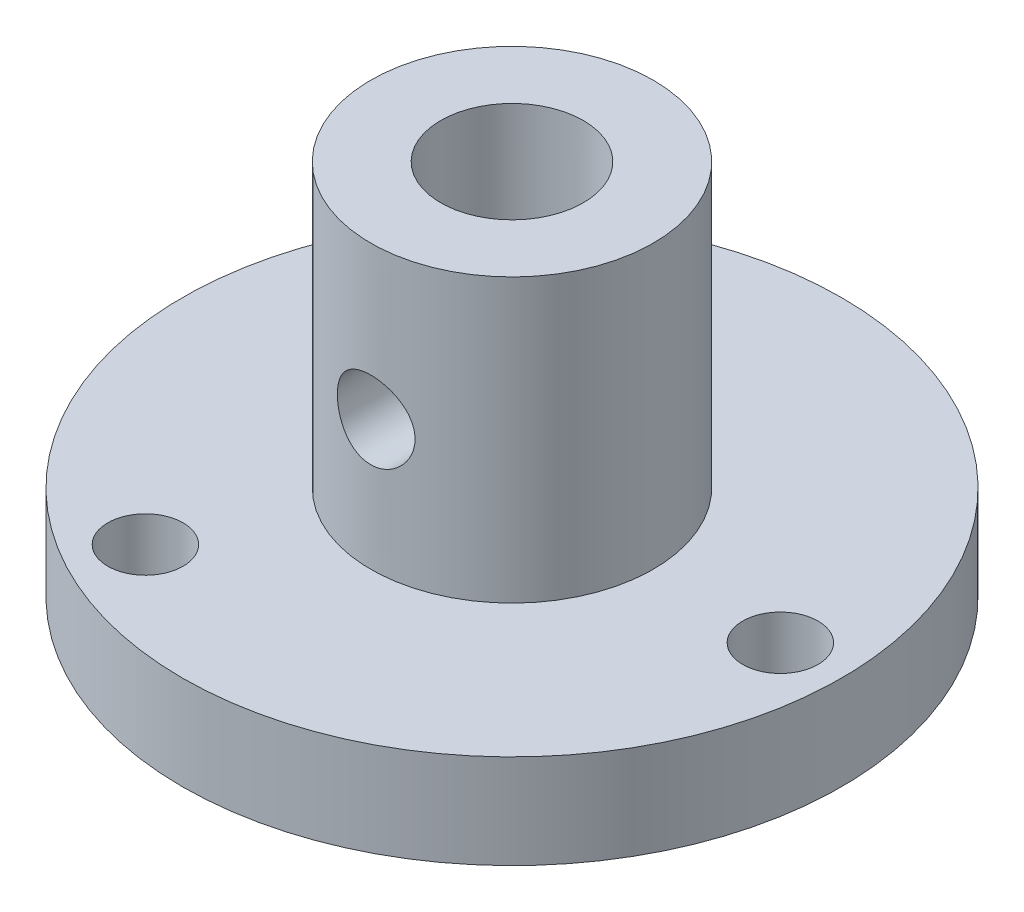
ISO-10303-21;
HEADER;
FILE_DESCRIPTION(('STEP AP214'),'2;1');
FILE_NAME('part.step','',(''),(''),'','','');
FILE_SCHEMA(('AUTOMOTIVE_DESIGN { 1 0 10303 214 1 1 1 1 }'));
ENDSEC;
DATA;
#1=APPLICATION_CONTEXT('core data for automotive mechanical design processes');
#2=APPLICATION_PROTOCOL_DEFINITION('international standard','automotive_design',2000,#1);
#3=PRODUCT_CONTEXT('',#1,'mechanical');
#4=PRODUCT('Part','Part','',(#3));
#5=PRODUCT_RELATED_PRODUCT_CATEGORY('part','',(#4));
#6=PRODUCT_DEFINITION_FORMATION('','',#4);
#7=PRODUCT_DEFINITION_CONTEXT('part definition',#1,'design');
#8=PRODUCT_DEFINITION('design','',#6,#7);
#9=PRODUCT_DEFINITION_SHAPE('','',#8);
#10=(LENGTH_UNIT() NAMED_UNIT(*) SI_UNIT(.MILLI.,.METRE.));
#11=(NAMED_UNIT(*) PLANE_ANGLE_UNIT() SI_UNIT($,.RADIAN.));
#12=(NAMED_UNIT(*) SI_UNIT($,.STERADIAN.) SOLID_ANGLE_UNIT());
#13=UNCERTAINTY_MEASURE_WITH_UNIT(LENGTH_MEASURE(1.E-05),#10,'distance_accuracy_value','');
#14=(GEOMETRIC_REPRESENTATION_CONTEXT(3) GLOBAL_UNCERTAINTY_ASSIGNED_CONTEXT((#13)) GLOBAL_UNIT_ASSIGNED_CONTEXT((#10,
#11,#12)) REPRESENTATION_CONTEXT('',''));
#15=CARTESIAN_POINT('',(0.,0.,0.));
#16=DIRECTION('',(0.,0.,1.));
#17=DIRECTION('',(1.,0.,0.));
#18=AXIS2_PLACEMENT_3D('',#15,#16,#17);
#19=CARTESIAN_POINT('',(-14.,0.,0.));
#20=DIRECTION('',(0.,1.,0.));
#21=DIRECTION('',(0.,0.,1.));
#22=AXIS2_PLACEMENT_3D('',#19,#20,#21);
#23=PLANE('',#22);
#24=CARTESIAN_POINT('',(11.4,0.,0.));
#25=DIRECTION('',(0.,-1.,0.));
#26=DIRECTION('',(0.,0.,-1.));
#27=AXIS2_PLACEMENT_3D('',#24,#25,#26);
#28=CIRCLE('',#27,1.6);
#29=CARTESIAN_POINT('',(11.4,0.,-1.6));
#30=VERTEX_POINT('',#29);
#31=EDGE_CURVE('E104',#30,#30,#28,.T.);
#32=ORIENTED_EDGE('',*,*,#31,.F.);
#33=EDGE_LOOP('',(#32));
#34=FACE_BOUND('',#33,.T.);
#35=CARTESIAN_POINT('',(-5.7,0.,-9.8726896031426));
#36=DIRECTION('',(0.,-1.,0.));
#37=DIRECTION('',(0.,0.,-1.));
#38=AXIS2_PLACEMENT_3D('',#35,#36,#37);
#39=CIRCLE('',#38,1.6);
#40=CARTESIAN_POINT('',(-5.7,0.,-11.4726896031426));
#41=VERTEX_POINT('',#40);
#42=EDGE_CURVE('E108',#41,#41,#39,.T.);
#43=ORIENTED_EDGE('',*,*,#42,.F.);
#44=EDGE_LOOP('',(#43));
#45=FACE_BOUND('',#44,.T.);
#46=CARTESIAN_POINT('',(-5.70000000000001,0.,9.8726896031426));
#47=DIRECTION('',(0.,-1.,0.));
#48=DIRECTION('',(0.,0.,-1.));
#49=AXIS2_PLACEMENT_3D('',#46,#47,#48);
#50=CIRCLE('',#49,1.6);
#51=CARTESIAN_POINT('',(-5.70000000000001,0.,8.2726896031426));
#52=VERTEX_POINT('',#51);
#53=EDGE_CURVE('E112',#52,#52,#50,.T.);
#54=ORIENTED_EDGE('',*,*,#53,.F.);
#55=EDGE_LOOP('',(#54));
#56=FACE_BOUND('',#55,.T.);
#57=CARTESIAN_POINT('',(0.,0.,0.));
#58=DIRECTION('',(0.,-1.,0.));
#59=DIRECTION('',(0.,0.,-1.));
#60=AXIS2_PLACEMENT_3D('',#57,#58,#59);
#61=CIRCLE('',#60,3.03);
#62=CARTESIAN_POINT('',(0.,0.,-3.03));
#63=VERTEX_POINT('',#62);
#64=EDGE_CURVE('E43',#63,#63,#61,.T.);
#65=ORIENTED_EDGE('',*,*,#64,.F.);
#66=EDGE_LOOP('',(#65));
#67=FACE_BOUND('',#66,.T.);
#68=CARTESIAN_POINT('',(0.,0.,0.));
#69=DIRECTION('',(0.,-1.,0.));
#70=DIRECTION('',(0.,0.,-1.));
#71=AXIS2_PLACEMENT_3D('',#68,#69,#70);
#72=CIRCLE('',#71,14.);
#73=CARTESIAN_POINT('',(0.,0.,-14.));
#74=VERTEX_POINT('',#73);
#75=EDGE_CURVE('E117',#74,#74,#72,.T.);
#76=ORIENTED_EDGE('',*,*,#75,.T.);
#77=EDGE_LOOP('',(#76));
#78=FACE_BOUND('',#77,.T.);
#79=ADVANCED_FACE('F31',(#34,#45,#56,#67,#78),#23,.F.);
#80=CARTESIAN_POINT('',(0.,0.,0.));
#81=DIRECTION('',(0.,-1.,0.));
#82=DIRECTION('',(0.,0.,-1.));
#83=AXIS2_PLACEMENT_3D('',#80,#81,#82);
#84=CYLINDRICAL_SURFACE('',#83,3.03);
#85=CARTESIAN_POINT('',(0.,11.15,-3.03));
#86=CARTESIAN_POINT('',(0.0857900428712125,11.1499945273613,-3.02999507756451));
#87=CARTESIAN_POINT('',(0.171653181634683,11.1432704140494,-3.02631917424866));
#88=CARTESIAN_POINT('',(0.340781906956645,11.1167004965323,-3.01197614440897));
#89=CARTESIAN_POINT('',(0.424043613362761,11.0968359878209,-3.00129905233361));
#90=CARTESIAN_POINT('',(0.585278058846019,11.0450217221375,-2.97405615459032));
#91=CARTESIAN_POINT('',(0.663270944531754,11.0131214804714,-2.9575144925062));
#92=CARTESIAN_POINT('',(0.812646234867152,10.9384320901137,-2.9200078154471));
#93=CARTESIAN_POINT('',(0.884028437355437,10.8956426085682,-2.89904266526161));
#94=CARTESIAN_POINT('',(1.02360718669968,10.7971176834172,-2.85287437137156));
#95=CARTESIAN_POINT('',(1.09125810199276,10.7407003617907,-2.82748010162747));
#96=CARTESIAN_POINT('',(1.21665314613362,10.6180165959611,-2.77583549606193));
#97=CARTESIAN_POINT('',(1.27438820626557,10.5517412381873,-2.74958440244971));
#98=CARTESIAN_POINT('',(1.38391353230633,10.4036366690131,-2.6962454424667));
#99=CARTESIAN_POINT('',(1.43459937338473,10.3209248099166,-2.66931958046948));
#100=CARTESIAN_POINT('',(1.52114231588487,10.1465870623383,-2.62097257045302));
#101=CARTESIAN_POINT('',(1.55701106668759,10.0549682469,-2.59954710299144));
#102=CARTESIAN_POINT('',(1.61037044280218,9.87117130692412,-2.56681491739963));
#103=CARTESIAN_POINT('',(1.62887665894372,9.77939216922618,-2.5549556850791));
#104=CARTESIAN_POINT('',(1.65000650284633,9.59333465582496,-2.54136898627085));
#105=CARTESIAN_POINT('',(1.65265197279999,9.49905989680712,-2.53962758638929));
#106=CARTESIAN_POINT('',(1.64272566474407,9.32580491202942,-2.54604787087849));
#107=CARTESIAN_POINT('',(1.63235357390399,9.24663089207596,-2.55277847780364));
#108=CARTESIAN_POINT('',(1.60056914879971,9.09139428157913,-2.57282496763416));
#109=CARTESIAN_POINT('',(1.57915198852743,9.01533306683123,-2.58614372904916));
#110=CARTESIAN_POINT('',(1.52558763297467,8.86636682623806,-2.6181037629647));
#111=CARTESIAN_POINT('',(1.49321577290092,8.79356736680224,-2.63685518592046));
#112=CARTESIAN_POINT('',(1.41885196086493,8.65405976576548,-2.6776025958069));
#113=CARTESIAN_POINT('',(1.37685581372334,8.58735429829242,-2.69959999614973));
#114=CARTESIAN_POINT('',(1.27691470037281,8.4511034635962,-2.74844219543159));
#115=CARTESIAN_POINT('',(1.21750905154334,8.38270595115796,-2.77551145314171));
#116=CARTESIAN_POINT('',(1.08808811563565,8.25631507641247,-2.82875671637267));
#117=CARTESIAN_POINT('',(1.01806588806105,8.19832857477771,-2.85493212372988));
#118=CARTESIAN_POINT('',(0.863760401968638,8.09081117325527,-2.90548056114207));
#119=CARTESIAN_POINT('',(0.778848407415769,8.04206753706778,-2.92962823392749));
#120=CARTESIAN_POINT('',(0.600395571549132,7.95998548407507,-2.97132813758002));
#121=CARTESIAN_POINT('',(0.506862806536939,7.92663282086067,-2.98888646494642));
#122=CARTESIAN_POINT('',(0.323034681068676,7.8794113640325,-3.01402528451312));
#123=CARTESIAN_POINT('',(0.233234505590317,7.86403104876656,-3.02237578233863));
#124=CARTESIAN_POINT('',(0.0519612365216904,7.84831577524807,-3.03090955802723));
#125=CARTESIAN_POINT('',(-0.0395107873152874,7.8479715114209,-3.03109788732686));
#126=CARTESIAN_POINT('',(-0.212201302224604,7.86163128214628,-3.02367808060858));
#127=CARTESIAN_POINT('',(-0.293565428252568,7.87426952196596,-3.01681206784779));
#128=CARTESIAN_POINT('',(-0.452811941335436,7.91124438807081,-2.99704865741896));
#129=CARTESIAN_POINT('',(-0.530693972082229,7.93558220854385,-2.98415064406224));
#130=CARTESIAN_POINT('',(-0.682933484711772,7.99568642887272,-2.95308035081049));
#131=CARTESIAN_POINT('',(-0.757166417229481,8.03170611190813,-2.93479208735981));
#132=CARTESIAN_POINT('',(-0.898735278200689,8.11382553469683,-2.89458091336468));
#133=CARTESIAN_POINT('',(-0.96606861349367,8.15992904412122,-2.8726566443029));
#134=CARTESIAN_POINT('',(-1.09985687563983,8.2667399524287,-2.82432562173432));
#135=CARTESIAN_POINT('',(-1.16539117367597,8.32849853961545,-2.79769128707377));
#136=CARTESIAN_POINT('',(-1.28565851355061,8.46189619053283,-2.7445064236284));
#137=CARTESIAN_POINT('',(-1.34038069850613,8.53354506413898,-2.71795600515957));
#138=CARTESIAN_POINT('',(-1.44144296354111,8.69120807301673,-2.66582275395467));
#139=CARTESIAN_POINT('',(-1.48685909053113,8.77789380054494,-2.64045810733742));
#140=CARTESIAN_POINT('',(-1.5620146479351,8.95942293979265,-2.59671373062503));
#141=CARTESIAN_POINT('',(-1.59177679971194,9.05425429428279,-2.57832388765429));
#142=CARTESIAN_POINT('',(-1.63181116277213,9.23964663572637,-2.553155869834));
#143=CARTESIAN_POINT('',(-1.64369992189415,9.32972331852865,-2.54542084192175));
#144=CARTESIAN_POINT('',(-1.65244841285955,9.51088351520292,-2.53975429160225));
#145=CARTESIAN_POINT('',(-1.64932010816836,9.60196616995851,-2.54181496535725));
#146=CARTESIAN_POINT('',(-1.62969251639885,9.7698014353432,-2.55442730368437));
#147=CARTESIAN_POINT('',(-1.61500210812894,9.84686579120213,-2.56382899719955));
#148=CARTESIAN_POINT('',(-1.57520631955416,9.99727293556493,-2.58846856654491));
#149=CARTESIAN_POINT('',(-1.55009681129436,10.0706142360872,-2.60370875535122));
#150=CARTESIAN_POINT('',(-1.48848742158327,10.2166423341148,-2.63944007384937));
#151=CARTESIAN_POINT('',(-1.45137426015481,10.2890023713195,-2.66019963867585));
#152=CARTESIAN_POINT('',(-1.36740126059422,10.4269535054421,-2.70432313258639));
#153=CARTESIAN_POINT('',(-1.320536212024,10.4925409556185,-2.72768845081609));
#154=CARTESIAN_POINT('',(-1.21004268810824,10.6255526561989,-2.77865728780117));
#155=CARTESIAN_POINT('',(-1.14494688094905,10.6917256633531,-2.80636278125282));
#156=CARTESIAN_POINT('',(-1.00406366861122,10.8126212889037,-2.85979585186758));
#157=CARTESIAN_POINT('',(-0.928268906415312,10.867335963262,-2.88552204902269));
#158=CARTESIAN_POINT('',(-0.764917768424048,10.9651765698142,-2.93313118704127));
#159=CARTESIAN_POINT('',(-0.677068287778425,11.0078878335823,-2.9548692341524));
#160=CARTESIAN_POINT('',(-0.493967094888029,11.0773473889644,-2.99090879954247));
#161=CARTESIAN_POINT('',(-0.398735372271816,11.1041371958607,-3.00522964555404));
#162=CARTESIAN_POINT('',(-0.251988685368914,11.1314276054095,-3.01991809867994));
#163=CARTESIAN_POINT('',(-0.201928869032613,11.1383776920939,-3.02368433863527));
#164=CARTESIAN_POINT('',(-0.101254523235277,11.1476654954939,-3.02872673719386));
#165=CARTESIAN_POINT('',(-0.050639995960278,11.1500032303796,-3.03000290560658));
#166=CARTESIAN_POINT('',(0.,11.15,-3.03));
#167=B_SPLINE_CURVE_WITH_KNOTS('',3,(#85,#86,#87,#88,#89,#90,#91,#92,#93,#94,#95,#96,#97,#98,
#99,#100,#101,#102,#103,#104,#105,#106,#107,#108,#109,#110,#111,#112,#113,#114,#115,#116,#117,
#118,#119,#120,#121,#122,#123,#124,#125,#126,#127,#128,#129,#130,#131,#132,#133,#134,#135,#136,
#137,#138,#139,#140,#141,#142,#143,#144,#145,#146,#147,#148,#149,#150,#151,#152,#153,#154,#155,
#156,#157,#158,#159,#160,#161,#162,#163,#164,#165,#166),.UNSPECIFIED.,.T.,.F.,(4,2,2,2,2,2,2,2,
2,2,2,2,2,2,2,2,2,2,2,2,2,2,2,2,2,2,2,2,2,2,2,2,2,2,2,2,2,2,2,2,4),(0.,0.25716611976656,
0.514699088908315,0.771183913754859,1.02767657957858,1.30158956442234,1.57575174231166,
1.87625985495446,2.17653125263254,2.45788269227609,2.73884658732321,2.9781211329188,
3.21750031529273,3.46212065282344,3.70684782265443,3.98930734983132,4.27195233508153,
4.5728392545761,4.87344710144834,5.14636968160961,5.41912335190411,5.66585440725143,
5.91261065203323,6.16512135217521,6.41772661108458,6.69826730882978,6.97908829302878,
7.28075844872988,7.58198952072092,7.85386805654175,8.12553003408864,8.36153546911974,
8.59763449682171,8.84847442837935,9.09944872956307,9.38877991240091,9.67831102868186,
9.97687239354469,10.274651803019,10.4264519669231,10.5782515328197),.UNSPECIFIED.);
#168=CARTESIAN_POINT('',(0.,11.15,-3.03));
#169=VERTEX_POINT('',#168);
#170=EDGE_CURVE('E77',#169,#169,#167,.T.);
#171=ORIENTED_EDGE('',*,*,#170,.T.);
#172=EDGE_LOOP('',(#171));
#173=FACE_BOUND('',#172,.T.);
#174=CARTESIAN_POINT('',(1.65,9.5,2.54133823014568));
#175=CARTESIAN_POINT('',(1.64999353945615,9.58472421530088,2.54134712585902));
#176=CARTESIAN_POINT('',(1.64342920708916,9.66952641945108,2.54564186902173));
#177=CARTESIAN_POINT('',(1.61755410896783,9.83642605210666,2.56215489225286));
#178=CARTESIAN_POINT('',(1.59822131181609,9.91851854761303,2.57438686700863));
#179=CARTESIAN_POINT('',(1.54795713636692,10.0772532041227,2.60491437120412));
#180=CARTESIAN_POINT('',(1.51709681190383,10.1539254006787,2.62317267665957));
#181=CARTESIAN_POINT('',(1.44487213666153,10.3009766410264,2.6636354289966));
#182=CARTESIAN_POINT('',(1.40350574748112,10.3713544599872,2.6858406414113));
#183=CARTESIAN_POINT('',(1.3066576437457,10.5114834793679,2.73436595183997));
#184=CARTESIAN_POINT('',(1.25018438217887,10.5804839476284,2.76087581094836));
#185=CARTESIAN_POINT('',(1.12677504308864,10.708634637244,2.81349984001044));
#186=CARTESIAN_POINT('',(1.05983287380224,10.767779081816,2.83961376980999));
#187=CARTESIAN_POINT('',(0.910561659034295,10.8794081382907,2.89110905067352));
#188=CARTESIAN_POINT('',(0.82741378733427,10.930921288293,2.91624623549301));
#189=CARTESIAN_POINT('',(0.652004051351834,11.0188791945719,2.96039590898524));
#190=CARTESIAN_POINT('',(0.559749059651932,11.055335207456,2.9794129706609));
#191=CARTESIAN_POINT('',(0.37673726465534,11.1090066955666,3.00779469063368));
#192=CARTESIAN_POINT('',(0.286475934792769,11.1275528184582,3.01782201644103));
#193=CARTESIAN_POINT('',(0.103614506201928,11.1493099298755,3.02960962687801));
#194=CARTESIAN_POINT('',(0.0110161891961425,11.1525322661908,3.03137602898891));
#195=CARTESIAN_POINT('',(-0.163675185219411,11.1439479826133,3.02670784855712));
#196=CARTESIAN_POINT('',(-0.245870449421747,11.1336508868384,3.02109689669488));
#197=CARTESIAN_POINT('',(-0.40715204925595,11.1010920112033,3.00361567875286));
#198=CARTESIAN_POINT('',(-0.486238146500599,11.0788293158247,2.9917449337217));
#199=CARTESIAN_POINT('',(-0.640236811028413,11.0229532559359,2.96263623427782));
#200=CARTESIAN_POINT('',(-0.71509277394048,10.9892156656007,2.94533970744241));
#201=CARTESIAN_POINT('',(-0.858231485444156,10.911586082078,2.90686080008397));
#202=CARTESIAN_POINT('',(-0.926512085663435,10.8676907858909,2.8856771560449));
#203=CARTESIAN_POINT('',(-1.06233570541702,10.7656641755814,2.83866882190573));
#204=CARTESIAN_POINT('',(-1.12902614517446,10.7065147339448,2.81259013421663));
#205=CARTESIAN_POINT('',(-1.2520408322937,10.5783310086638,2.76003223542779));
#206=CARTESIAN_POINT('',(-1.30835458530213,10.5092868421519,2.73355264784478));
#207=CARTESIAN_POINT('',(-1.41378308186188,10.3561952253107,2.68064992013962));
#208=CARTESIAN_POINT('',(-1.46187977813732,10.2713714833037,2.65442269324622));
#209=CARTESIAN_POINT('',(-1.54279227269032,10.093159910296,2.60823308473491));
#210=CARTESIAN_POINT('',(-1.57562566143025,9.99978208697068,2.58826350008692));
#211=CARTESIAN_POINT('',(-1.62223760723878,9.81491823076938,2.55928675625625));
#212=CARTESIAN_POINT('',(-1.63734433634037,9.72389175982806,2.54952257637173));
#213=CARTESIAN_POINT('',(-1.65207824953767,9.5401141080285,2.54000579261734));
#214=CARTESIAN_POINT('',(-1.65172219888464,9.44736490411218,2.54024234561859));
#215=CARTESIAN_POINT('',(-1.63675713034711,9.27683477798165,2.54989643021449));
#216=CARTESIAN_POINT('',(-1.62416638247546,9.19878846302743,2.55801375967497));
#217=CARTESIAN_POINT('',(-1.58828532206471,9.04612607961223,2.58044457396198));
#218=CARTESIAN_POINT('',(-1.56499048930346,8.97151147498478,2.59476067631742));
#219=CARTESIAN_POINT('',(-1.5073830252195,8.82410795800633,2.62865987907484));
#220=CARTESIAN_POINT('',(-1.47264024110854,8.75153501904172,2.64844274796385));
#221=CARTESIAN_POINT('',(-1.3934804099986,8.61281452316288,2.69093478256053));
#222=CARTESIAN_POINT('',(-1.34905852345307,8.54667020456604,2.71364540981798));
#223=CARTESIAN_POINT('',(-1.24380707121232,8.41195817111973,2.76364554601909));
#224=CARTESIAN_POINT('',(-1.18150231857118,8.34459871542959,2.79109986984224));
#225=CARTESIAN_POINT('',(-1.04623416765922,8.22081915393236,2.84457135545475));
#226=CARTESIAN_POINT('',(-0.973264880350119,8.1644051326008,2.87058771217686));
#227=CARTESIAN_POINT('',(-0.814258886233018,8.06164871593835,2.91978125030048));
#228=CARTESIAN_POINT('',(-0.727766000551714,8.01591229227594,2.94276477327884));
#229=CARTESIAN_POINT('',(-0.546708794977013,7.94012416570404,2.98170263401183));
#230=CARTESIAN_POINT('',(-0.452152853928872,7.91005640612249,2.99766416502198));
#231=CARTESIAN_POINT('',(-0.267931513660839,7.86945013722957,3.01940937241666));
#232=CARTESIAN_POINT('',(-0.178735534906024,7.857247031986,3.02605760088664));
#233=CARTESIAN_POINT('',(0.000672915756625529,7.84756045236229,3.03132580445517));
#234=CARTESIAN_POINT('',(0.0908848525146871,7.85006955999504,3.0299498254098));
#235=CARTESIAN_POINT('',(0.26146043880764,7.8687856783607,3.01980299890793));
#236=CARTESIAN_POINT('',(0.3420002734873,7.88378732361397,3.0116830336581));
#237=CARTESIAN_POINT('',(0.499230660709057,7.92523625591434,2.98964436253134));
#238=CARTESIAN_POINT('',(0.575920743807066,7.9516849350634,2.97572495137723));
#239=CARTESIAN_POINT('',(0.72639122743587,8.01615544957367,2.94268624244928));
#240=CARTESIAN_POINT('',(0.799972433765325,8.05455393083812,2.92340026823324));
#241=CARTESIAN_POINT('',(0.939897855118299,8.14136843401182,2.88146419069563));
#242=CARTESIAN_POINT('',(1.00623905754384,8.18978860189965,2.85881269615373));
#243=CARTESIAN_POINT('',(1.13779080239035,8.30158185617614,2.80923744166575));
#244=CARTESIAN_POINT('',(1.20201783100304,8.36602847504133,2.78212061191106));
#245=CARTESIAN_POINT('',(1.31922290674401,8.50480615883968,2.72850051121066));
#246=CARTESIAN_POINT('',(1.37218766221593,8.57914873658033,2.70199799776912));
#247=CARTESIAN_POINT('',(1.46847601630133,8.74136845734659,2.65096760184843));
#248=CARTESIAN_POINT('',(1.51099432409162,8.82980001515857,2.62666530235699));
#249=CARTESIAN_POINT('',(1.57992984968463,9.01426393544002,2.58579932900623));
#250=CARTESIAN_POINT('',(1.6063988980812,9.1102706864721,2.56921078470726));
#251=CARTESIAN_POINT('',(1.63263105906225,9.2562810378648,2.55254918356817));
#252=CARTESIAN_POINT('',(1.63912905778446,9.30469075090807,2.54836860583149));
#253=CARTESIAN_POINT('',(1.64781540057713,9.40205828550864,2.54276055454605));
#254=CARTESIAN_POINT('',(1.65000373520817,9.45101610826623,2.54133308702742));
#255=CARTESIAN_POINT('',(1.65,9.5,2.54133823014568));
#256=B_SPLINE_CURVE_WITH_KNOTS('',3,(#174,#175,#176,#177,#178,#179,#180,#181,#182,#183,#184,
#185,#186,#187,#188,#189,#190,#191,#192,#193,#194,#195,#196,#197,#198,#199,#200,#201,#202,#203,
#204,#205,#206,#207,#208,#209,#210,#211,#212,#213,#214,#215,#216,#217,#218,#219,#220,#221,#222,
#223,#224,#225,#226,#227,#228,#229,#230,#231,#232,#233,#234,#235,#236,#237,#238,#239,#240,#241,
#242,#243,#244,#245,#246,#247,#248,#249,#250,#251,#252,#253,#254,#255),.UNSPECIFIED.,.T.,.F.,(4,
2,2,2,2,2,2,2,2,2,2,2,2,2,2,2,2,2,2,2,2,2,2,2,2,2,2,2,2,2,2,2,2,2,2,2,2,2,2,2,4),(0.,
0.2539649756376,0.508369304975036,0.76123073015235,1.01414125338207,1.29207122181086,
1.57016352109699,1.87152687706575,2.17266452636346,2.44915306323705,2.72543681894844,
2.97334551698518,3.22127318584726,3.47197515356756,3.72275875733957,4.00024378673958,
4.27800792566553,4.57936983587441,4.88038357002479,5.15701189280749,5.43334029361615,
5.67067706967246,5.9081141627845,6.15574681906021,6.40350357683698,6.68959086981509,
6.97583674352027,7.27568458817317,7.57522455249125,7.84453628975653,8.11371225008803,
8.35957167034152,8.60546099856925,8.86005735908664,9.11475925757768,9.39837862928668,
9.68233089125851,9.98395720638341,10.2846041670604,10.4314354546566,10.5782670638562),.UNSPECIFIED.);
#257=CARTESIAN_POINT('',(1.65,9.5,2.54133823014568));
#258=VERTEX_POINT('',#257);
#259=EDGE_CURVE('E72',#258,#258,#256,.T.);
#260=ORIENTED_EDGE('',*,*,#259,.T.);
#261=EDGE_LOOP('',(#260));
#262=FACE_BOUND('',#261,.T.);
#263=CARTESIAN_POINT('',(0.,16.,0.));
#264=DIRECTION('',(0.,-1.,0.));
#265=DIRECTION('',(0.,0.,-1.));
#266=AXIS2_PLACEMENT_3D('',#263,#264,#265);
#267=CIRCLE('',#266,3.03);
#268=CARTESIAN_POINT('',(0.,16.,-3.03));
#269=VERTEX_POINT('',#268);
#270=EDGE_CURVE('E47',#269,#269,#267,.T.);
#271=ORIENTED_EDGE('',*,*,#270,.F.);
#272=EDGE_LOOP('',(#271));
#273=FACE_BOUND('',#272,.T.);
#274=ORIENTED_EDGE('',*,*,#64,.T.);
#275=EDGE_LOOP('',(#274));
#276=FACE_BOUND('',#275,.T.);
#277=ADVANCED_FACE('F82',(#173,#262,#273,#276),#84,.F.);
#278=CARTESIAN_POINT('',(-3.03,16.,0.));
#279=DIRECTION('',(0.,-1.,0.));
#280=DIRECTION('',(0.,0.,-1.));
#281=AXIS2_PLACEMENT_3D('',#278,#279,#280);
#282=PLANE('',#281);
#283=CARTESIAN_POINT('',(0.,16.,0.));
#284=DIRECTION('',(0.,-1.,0.));
#285=DIRECTION('',(0.,0.,-1.));
#286=AXIS2_PLACEMENT_3D('',#283,#284,#285);
#287=CIRCLE('',#286,6.);
#288=CARTESIAN_POINT('',(0.,16.,-6.));
#289=VERTEX_POINT('',#288);
#290=EDGE_CURVE('E131',#289,#289,#287,.T.);
#291=ORIENTED_EDGE('',*,*,#290,.F.);
#292=EDGE_LOOP('',(#291));
#293=FACE_BOUND('',#292,.T.);
#294=ORIENTED_EDGE('',*,*,#270,.T.);
#295=EDGE_LOOP('',(#294));
#296=FACE_BOUND('',#295,.T.);
#297=ADVANCED_FACE('F85',(#293,#296),#282,.F.);
#298=CARTESIAN_POINT('',(0.,0.,0.));
#299=DIRECTION('',(0.,-1.,0.));
#300=DIRECTION('',(0.,0.,-1.));
#301=AXIS2_PLACEMENT_3D('',#298,#299,#300);
#302=CYLINDRICAL_SURFACE('',#301,6.);
#303=CARTESIAN_POINT('',(0.,11.15,-6.));
#304=CARTESIAN_POINT('',(-0.090853728327696,11.1499980709964,-5.99999874308259));
#305=CARTESIAN_POINT('',(-0.181727733575568,11.1424708991275,-5.99791622790463));
#306=CARTESIAN_POINT('',(-0.360851012556402,11.1126187018067,-5.98981117624032));
#307=CARTESIAN_POINT('',(-0.449099121993647,11.0902872114916,-5.98378691845857));
#308=CARTESIAN_POINT('',(-0.620359675500261,11.0316125135351,-5.96846215356675));
#309=CARTESIAN_POINT('',(-0.703378936424505,10.995288007773,-5.95916602079348));
#310=CARTESIAN_POINT('',(-0.862147532275072,10.9097295268383,-5.9382760100701));
#311=CARTESIAN_POINT('',(-0.937896261330001,10.8604944770718,-5.92668194087358));
#312=CARTESIAN_POINT('',(-1.08183136781088,10.7492381199734,-5.90212624569014));
#313=CARTESIAN_POINT('',(-1.14981405351216,10.6869587042041,-5.88914009329631));
#314=CARTESIAN_POINT('',(-1.27451362220699,10.5519328342995,-5.86341857808967));
#315=CARTESIAN_POINT('',(-1.33122895521962,10.47918494245,-5.85068324999801));
#316=CARTESIAN_POINT('',(-1.43279568288042,10.3236380028199,-5.82665244921014));
#317=CARTESIAN_POINT('',(-1.47740934109683,10.2406785173047,-5.81538781414375));
#318=CARTESIAN_POINT('',(-1.55197373568299,10.0680759195132,-5.79593589094513));
#319=CARTESIAN_POINT('',(-1.58192736761612,9.9784341311204,-5.78774799518745));
#320=CARTESIAN_POINT('',(-1.62560750003859,9.79727533624055,-5.7756304093822));
#321=CARTESIAN_POINT('',(-1.63970484886952,9.70585440576672,-5.77160359132479));
#322=CARTESIAN_POINT('',(-1.65242890666582,9.52186326388271,-5.76797418839314));
#323=CARTESIAN_POINT('',(-1.65105870633264,9.42929328576605,-5.76837071965197));
#324=CARTESIAN_POINT('',(-1.63318021863208,9.24855455128155,-5.77345648215431));
#325=CARTESIAN_POINT('',(-1.61712435820282,9.16033685132934,-5.77801741181752));
#326=CARTESIAN_POINT('',(-1.57105645702899,8.9878984571429,-5.79071212543296));
#327=CARTESIAN_POINT('',(-1.54104323793963,8.90367810104466,-5.79884621104432));
#328=CARTESIAN_POINT('',(-1.46755257403608,8.74046335350014,-5.8178810068791));
#329=CARTESIAN_POINT('',(-1.42391940277051,8.66154293706775,-5.82881343808643));
#330=CARTESIAN_POINT('',(-1.32453594216561,8.51198691032996,-5.8521965018176));
#331=CARTESIAN_POINT('',(-1.26878313205863,8.44135302825628,-5.86464744994142));
#332=CARTESIAN_POINT('',(-1.14444557863618,8.30779451200269,-5.89019543667637));
#333=CARTESIAN_POINT('',(-1.07548193780207,8.24522350991206,-5.90329988395932));
#334=CARTESIAN_POINT('',(-0.927879174135835,8.13245990828774,-5.92829105959038));
#335=CARTESIAN_POINT('',(-0.849239620758373,8.08226785987435,-5.94017773370854));
#336=CARTESIAN_POINT('',(-0.683947027422495,7.99551741834777,-5.96147504122309));
#337=CARTESIAN_POINT('',(-0.597256901414117,7.95902646630246,-5.97087336103955));
#338=CARTESIAN_POINT('',(-0.418654132043704,7.90124030070409,-5.98604617450553));
#339=CARTESIAN_POINT('',(-0.326742710235056,7.87994154852351,-5.9918215119967));
#340=CARTESIAN_POINT('',(-0.143321506269138,7.85370760850691,-5.99896860669685));
#341=CARTESIAN_POINT('',(-0.0518853661978217,7.84829201366681,-6.00046960488126));
#342=CARTESIAN_POINT('',(0.130589884597511,7.85264666541253,-5.99927229231555));
#343=CARTESIAN_POINT('',(0.221629038059001,7.86241523474667,-5.9965744453723));
#344=CARTESIAN_POINT('',(0.398987770207999,7.89646806148249,-5.98736635921293));
#345=CARTESIAN_POINT('',(0.485363423879033,7.92048130178516,-5.98092734475059));
#346=CARTESIAN_POINT('',(0.652849667611913,7.98202439492075,-5.96497031766694));
#347=CARTESIAN_POINT('',(0.733959668311755,8.01955575771148,-5.95545196109898));
#348=CARTESIAN_POINT('',(0.890455295917685,8.10794021664957,-5.93409297712807));
#349=CARTESIAN_POINT('',(0.965689503643772,8.15905061369237,-5.92220874688328));
#350=CARTESIAN_POINT('',(1.1066809671127,8.2728215403214,-5.89749009177705));
#351=CARTESIAN_POINT('',(1.17243622308682,8.33548450080894,-5.88465546727347));
#352=CARTESIAN_POINT('',(1.29465015721015,8.47282845250335,-5.85900191245661));
#353=CARTESIAN_POINT('',(1.35076903800646,8.54781465907045,-5.84619510636324));
#354=CARTESIAN_POINT('',(1.44963820489912,8.70641351333613,-5.82246888214058));
#355=CARTESIAN_POINT('',(1.49238901579837,8.79002582222027,-5.81154938992678));
#356=CARTESIAN_POINT('',(1.56298916810733,8.96311233018453,-5.79296111659894));
#357=CARTESIAN_POINT('',(1.59092227269254,9.05255029883061,-5.78527411484172));
#358=CARTESIAN_POINT('',(1.63127619202049,9.23510353746249,-5.77402677636451));
#359=CARTESIAN_POINT('',(1.64370128166884,9.32821778674823,-5.77046530242997));
#360=CARTESIAN_POINT('',(1.65242931750206,9.51198988281324,-5.76797147491958));
#361=CARTESIAN_POINT('',(1.64928014369359,9.60261995085517,-5.76888180213839));
#362=CARTESIAN_POINT('',(1.62822879843177,9.7820034160007,-5.77485828369775));
#363=CARTESIAN_POINT('',(1.61032705344816,9.87075686727777,-5.77992431790444));
#364=CARTESIAN_POINT('',(1.56060549557288,10.0431289773482,-5.7935447800639));
#365=CARTESIAN_POINT('',(1.52890872620598,10.1267857426572,-5.80206832439478));
#366=CARTESIAN_POINT('',(1.45259209961126,10.2876586099881,-5.82164247853969));
#367=CARTESIAN_POINT('',(1.40797010013714,10.3648736416131,-5.83269350719869));
#368=CARTESIAN_POINT('',(1.30543867870844,10.5132691730546,-5.85650727490599));
#369=CARTESIAN_POINT('',(1.24715873005677,10.58418685503,-5.8693126029988));
#370=CARTESIAN_POINT('',(1.11966133853961,10.7154137111234,-5.89496224754912));
#371=CARTESIAN_POINT('',(1.05044120164629,10.7757202644943,-5.9078065728436));
#372=CARTESIAN_POINT('',(0.901092250249274,10.8853925925794,-5.93244341761611));
#373=CARTESIAN_POINT('',(0.820747709123239,10.9344722561096,-5.94420464277088));
#374=CARTESIAN_POINT('',(0.652625872638597,11.0183518667129,-5.96500063379118));
#375=CARTESIAN_POINT('',(0.564853084925044,11.0531603999617,-5.97403703816731));
#376=CARTESIAN_POINT('',(0.397919658743002,11.103303632515,-5.98728597467612));
#377=CARTESIAN_POINT('',(0.319434916548891,11.1207725479514,-5.99201791048024));
#378=CARTESIAN_POINT('',(0.160638594873061,11.1441209302487,-5.99837530343306));
#379=CARTESIAN_POINT('',(0.0803272226686442,11.1500017055051,-6.00000111128829));
#380=CARTESIAN_POINT('',(0.,11.15,-6.));
#381=B_SPLINE_CURVE_WITH_KNOTS('',3,(#303,#304,#305,#306,#307,#308,#309,#310,#311,#312,#313,
#314,#315,#316,#317,#318,#319,#320,#321,#322,#323,#324,#325,#326,#327,#328,#329,#330,#331,#332,
#333,#334,#335,#336,#337,#338,#339,#340,#341,#342,#343,#344,#345,#346,#347,#348,#349,#350,#351,
#352,#353,#354,#355,#356,#357,#358,#359,#360,#361,#362,#363,#364,#365,#366,#367,#368,#369,#370,
#371,#372,#373,#374,#375,#376,#377,#378,#379,#380),.UNSPECIFIED.,.T.,.F.,(4,2,2,2,2,2,2,2,2,2,2,
2,2,2,2,2,2,2,2,2,2,2,2,2,2,2,2,2,2,2,2,2,2,2,2,2,2,2,4),(0.,0.272266491235062,
0.544651956274203,0.816674629991575,1.08871995238569,1.36676668474294,1.64485163984642,
1.92805811024662,2.21120862075008,2.48758935156345,2.76391485738987,3.03200413559448,
3.30011605124618,3.57141329094732,3.84276701193229,4.12355975427328,4.4043649954619,
4.68653487032465,4.96863899957848,5.24211776230094,5.51556631854553,5.78397200237263,
6.05240767608969,6.32634577802897,6.60034158820947,6.88259284524954,7.16483302029487,
7.44546024030154,7.72601008612323,7.99676228549106,8.26750665818486,8.5358841136017,
8.80430607576226,9.08108736952956,9.3579369273538,9.64120588287105,9.92430415962331,
10.1650524617278,10.4057735798283),.UNSPECIFIED.);
#382=CARTESIAN_POINT('',(0.,11.15,-6.));
#383=VERTEX_POINT('',#382);
#384=EDGE_CURVE('E34',#383,#383,#381,.T.);
#385=ORIENTED_EDGE('',*,*,#384,.T.);
#386=EDGE_LOOP('',(#385));
#387=FACE_BOUND('',#386,.T.);
#388=CARTESIAN_POINT('',(1.65,9.5,5.76866535690882));
#389=CARTESIAN_POINT('',(1.64999803744472,9.40921955335825,5.76866681542244));
#390=CARTESIAN_POINT('',(1.64248258154128,9.31841876938433,5.77083168489651));
#391=CARTESIAN_POINT('',(1.61268113160831,9.13944729227741,5.77922931898766));
#392=CARTESIAN_POINT('',(1.59038833565189,9.05127782986673,5.78546395687621));
#393=CARTESIAN_POINT('',(1.53182668713213,8.88018421281183,5.8012427959002));
#394=CARTESIAN_POINT('',(1.49557833657748,8.79725257039649,5.81078214006462));
#395=CARTESIAN_POINT('',(1.4101995918537,8.63863278184509,5.83208926824761));
#396=CARTESIAN_POINT('',(1.36106796655278,8.56294532891123,5.84385726520744));
#397=CARTESIAN_POINT('',(1.24991964518897,8.41894953768282,5.8686465288998));
#398=CARTESIAN_POINT('',(1.1876215346316,8.35086238877202,5.88169112663028));
#399=CARTESIAN_POINT('',(1.05251338107009,8.22595879824098,5.90736293037451));
#400=CARTESIAN_POINT('',(0.979702190581916,8.16914358854209,5.91999009064058));
#401=CARTESIAN_POINT('',(0.824091417921743,8.06746519622698,5.94366575662943));
#402=CARTESIAN_POINT('',(0.741142186315804,8.02282326362092,5.9546835378627));
#403=CARTESIAN_POINT('',(0.568561338575523,7.94820386122523,5.97363053761389));
#404=CARTESIAN_POINT('',(0.478930927041655,7.91822375527836,5.98156031129505));
#405=CARTESIAN_POINT('',(0.297842110789118,7.87449875531735,5.99327282902112));
#406=CARTESIAN_POINT('',(0.206480953697208,7.8603772839833,5.99715160352105));
#407=CARTESIAN_POINT('',(0.0226094627200635,7.84758420132032,6.00066142983201));
#408=CARTESIAN_POINT('',(-0.0699006641776036,7.84890984638381,6.00029323595966));
#409=CARTESIAN_POINT('',(-0.250818004668653,7.86671114639083,5.99542038051176));
#410=CARTESIAN_POINT('',(-0.339268726185946,7.88277972798328,5.9910268682886));
#411=CARTESIAN_POINT('',(-0.512166240031457,7.9289513845931,5.97872912336679));
#412=CARTESIAN_POINT('',(-0.596612796751147,7.95905528433458,5.97082468436518));
#413=CARTESIAN_POINT('',(-0.76012676990918,8.03274614554668,5.95223107363847));
#414=CARTESIAN_POINT('',(-0.839129261966645,8.07646980011384,5.94151385162518));
#415=CARTESIAN_POINT('',(-0.988812528588861,8.17605339164662,5.91844520458615));
#416=CARTESIAN_POINT('',(-1.05949158844747,8.23191582259504,5.90609344393908));
#417=CARTESIAN_POINT('',(-1.19295184933328,8.35634061131931,5.88061532945822));
#418=CARTESIAN_POINT('',(-1.25540056574357,8.4252575455875,5.86747685059754));
#419=CARTESIAN_POINT('',(-1.36793848619848,8.57272042191696,5.84226662316506));
#420=CARTESIAN_POINT('',(-1.41802683438027,8.65126703019763,5.83019494849858));
#421=CARTESIAN_POINT('',(-1.50469703763152,8.81651707691904,5.80843406835838));
#422=CARTESIAN_POINT('',(-1.54118305341272,8.90327318726381,5.79876192329638));
#423=CARTESIAN_POINT('',(-1.59894009136598,9.0820216149048,5.78310436235825));
#424=CARTESIAN_POINT('',(-1.6202151643252,9.17401253108294,5.77711796499911));
#425=CARTESIAN_POINT('',(-1.64636178324791,9.3574964107951,5.76972035320552));
#426=CARTESIAN_POINT('',(-1.6517315769404,9.4489128479357,5.76817022285768));
#427=CARTESIAN_POINT('',(-1.64729247824814,9.63133853039987,5.76943959387622));
#428=CARTESIAN_POINT('',(-1.63748531887187,9.72234782102419,5.77225859634512));
#429=CARTESIAN_POINT('',(-1.60341110080102,9.89941887867531,5.78181388299925));
#430=CARTESIAN_POINT('',(-1.57944858294858,9.9855441432779,5.78846759511702));
#431=CARTESIAN_POINT('',(-1.51808880834985,10.1525516832155,5.80486075000443));
#432=CARTESIAN_POINT('',(-1.48068971625608,10.2334332405122,5.81460061430065));
#433=CARTESIAN_POINT('',(-1.39252303885361,10.3897280941801,5.83634995588392));
#434=CARTESIAN_POINT('',(-1.34146564228391,10.4649711581214,5.84840681329183));
#435=CARTESIAN_POINT('',(-1.2277872440241,10.6060043625999,5.87332256443653));
#436=CARTESIAN_POINT('',(-1.16516392562852,10.6717926045915,5.88618161851454));
#437=CARTESIAN_POINT('',(-1.02781750590111,10.7941433550375,5.91173499394532));
#438=CARTESIAN_POINT('',(-0.952779703449058,10.8503569850071,5.92441187573805));
#439=CARTESIAN_POINT('',(-0.794045946471831,10.9493930304425,5.94776568995451));
#440=CARTESIAN_POINT('',(-0.710350452233267,10.9922161573285,5.95844272861526));
#441=CARTESIAN_POINT('',(-0.537265018353876,11.0628544133132,5.97652506377789));
#442=CARTESIAN_POINT('',(-0.447923954411471,11.0907827009357,5.98395494908837));
#443=CARTESIAN_POINT('',(-0.265580317975266,11.1311595169683,5.99481425560821));
#444=CARTESIAN_POINT('',(-0.172578617937356,11.1436117110934,5.99824462414352));
#445=CARTESIAN_POINT('',(0.0111958773090329,11.1524411904116,6.00067051691051));
#446=CARTESIAN_POINT('',(0.101942634810781,11.1493287322635,5.99980681919578));
#447=CARTESIAN_POINT('',(0.281569554656666,11.1283104181902,5.99406321514946));
#448=CARTESIAN_POINT('',(0.370449795011793,11.1104051817952,5.98918347701204));
#449=CARTESIAN_POINT('',(0.543165745839328,11.0606052391115,5.97598710157646));
#450=CARTESIAN_POINT('',(0.627035168123876,11.0288198519094,5.9676973503156));
#451=CARTESIAN_POINT('',(0.788297966420385,10.9522591673682,5.94854501555121));
#452=CARTESIAN_POINT('',(0.865690389200813,10.9074819623165,5.93768205424174));
#453=CARTESIAN_POINT('',(1.01415403207421,10.8047479640136,5.91416124461071));
#454=CARTESIAN_POINT('',(1.08498744614407,10.7464571107366,5.90146164079604));
#455=CARTESIAN_POINT('',(1.21603947801472,10.6189762735603,5.87585872928397));
#456=CARTESIAN_POINT('',(1.27625523789272,10.5497833646479,5.86295536775691));
#457=CARTESIAN_POINT('',(1.38578701268236,10.4004821947995,5.83805027961809));
#458=CARTESIAN_POINT('',(1.43480949541505,10.3201533367829,5.82607732195824));
#459=CARTESIAN_POINT('',(1.51858609627287,10.1520743939811,5.80480632889601));
#460=CARTESIAN_POINT('',(1.55334897834329,10.0643289075719,5.79550665155144));
#461=CARTESIAN_POINT('',(1.6034019574589,9.89750366779768,5.78183943348555));
#462=CARTESIAN_POINT('',(1.62083357797553,9.81910375198116,5.77694065884767));
#463=CARTESIAN_POINT('',(1.64413270596965,9.66047435965551,5.77035318708946));
#464=CARTESIAN_POINT('',(1.65000173479532,9.58024512524438,5.76866406765974));
#465=CARTESIAN_POINT('',(1.65,9.5,5.76866535690882));
#466=B_SPLINE_CURVE_WITH_KNOTS('',3,(#388,#389,#390,#391,#392,#393,#394,#395,#396,#397,#398,
#399,#400,#401,#402,#403,#404,#405,#406,#407,#408,#409,#410,#411,#412,#413,#414,#415,#416,#417,
#418,#419,#420,#421,#422,#423,#424,#425,#426,#427,#428,#429,#430,#431,#432,#433,#434,#435,#436,
#437,#438,#439,#440,#441,#442,#443,#444,#445,#446,#447,#448,#449,#450,#451,#452,#453,#454,#455,
#456,#457,#458,#459,#460,#461,#462,#463,#464,#465),.UNSPECIFIED.,.T.,.F.,(4,2,2,2,2,2,2,2,2,2,2,
2,2,2,2,2,2,2,2,2,2,2,2,2,2,2,2,2,2,2,2,2,2,2,2,2,2,2,4),(0.,0.272046051104016,
0.544217410515629,0.815990441281183,1.08778945227587,1.36612384486572,1.64448864015853,
1.92761862185042,2.21069767879603,2.48690242321262,2.76305811084345,3.03181099442101,
3.30057967207718,3.57213780160766,3.84375177719016,4.12421818647043,4.40470401050125,
4.68713031851458,4.9694813862591,5.24288876991941,5.5162649363549,5.78396348444837,
6.0516986123097,6.32564040616629,6.59963713140791,6.88212071608134,7.16458929021235,
7.44488018041167,7.72510466738726,7.9962039644357,8.2672919082614,8.5362822407824,
8.80531209172669,9.08187822938626,9.35851869627828,9.64174339988021,9.92479377192828,
10.1652997746179,10.4057741306126),.UNSPECIFIED.);
#467=CARTESIAN_POINT('',(1.65,9.5,5.76866535690882));
#468=VERTEX_POINT('',#467);
#469=EDGE_CURVE('E10',#468,#468,#466,.T.);
#470=ORIENTED_EDGE('',*,*,#469,.T.);
#471=EDGE_LOOP('',(#470));
#472=FACE_BOUND('',#471,.T.);
#473=CARTESIAN_POINT('',(0.,4.,0.));
#474=DIRECTION('',(0.,-1.,0.));
#475=DIRECTION('',(0.,0.,-1.));
#476=AXIS2_PLACEMENT_3D('',#473,#474,#475);
#477=CIRCLE('',#476,6.);
#478=CARTESIAN_POINT('',(0.,4.,-6.));
#479=VERTEX_POINT('',#478);
#480=EDGE_CURVE('E122',#479,#479,#477,.T.);
#481=ORIENTED_EDGE('',*,*,#480,.F.);
#482=EDGE_LOOP('',(#481));
#483=FACE_BOUND('',#482,.T.);
#484=ORIENTED_EDGE('',*,*,#290,.T.);
#485=EDGE_LOOP('',(#484));
#486=FACE_BOUND('',#485,.T.);
#487=ADVANCED_FACE('F55',(#387,#472,#483,#486),#302,.T.);
#488=CARTESIAN_POINT('',(-6.,4.,0.));
#489=DIRECTION('',(0.,-1.,0.));
#490=DIRECTION('',(0.,0.,-1.));
#491=AXIS2_PLACEMENT_3D('',#488,#489,#490);
#492=PLANE('',#491);
#493=CARTESIAN_POINT('',(11.4,4.,0.));
#494=DIRECTION('',(0.,-1.,0.));
#495=DIRECTION('',(0.,0.,-1.));
#496=AXIS2_PLACEMENT_3D('',#493,#494,#495);
#497=CIRCLE('',#496,1.6);
#498=CARTESIAN_POINT('',(11.4,4.,-1.6));
#499=VERTEX_POINT('',#498);
#500=EDGE_CURVE('E53',#499,#499,#497,.T.);
#501=ORIENTED_EDGE('',*,*,#500,.T.);
#502=EDGE_LOOP('',(#501));
#503=FACE_BOUND('',#502,.T.);
#504=CARTESIAN_POINT('',(-5.7,4.,-9.8726896031426));
#505=DIRECTION('',(0.,-1.,0.));
#506=DIRECTION('',(0.,0.,-1.));
#507=AXIS2_PLACEMENT_3D('',#504,#505,#506);
#508=CIRCLE('',#507,1.6);
#509=CARTESIAN_POINT('',(-5.7,4.,-11.4726896031426));
#510=VERTEX_POINT('',#509);
#511=EDGE_CURVE('E125',#510,#510,#508,.T.);
#512=ORIENTED_EDGE('',*,*,#511,.T.);
#513=EDGE_LOOP('',(#512));
#514=FACE_BOUND('',#513,.T.);
#515=CARTESIAN_POINT('',(-5.70000000000001,4.,9.8726896031426));
#516=DIRECTION('',(0.,-1.,0.));
#517=DIRECTION('',(0.,0.,-1.));
#518=AXIS2_PLACEMENT_3D('',#515,#516,#517);
#519=CIRCLE('',#518,1.6);
#520=CARTESIAN_POINT('',(-5.70000000000001,4.,8.2726896031426));
#521=VERTEX_POINT('',#520);
#522=EDGE_CURVE('E136',#521,#521,#519,.T.);
#523=ORIENTED_EDGE('',*,*,#522,.T.);
#524=EDGE_LOOP('',(#523));
#525=FACE_BOUND('',#524,.T.);
#526=CARTESIAN_POINT('',(0.,4.,0.));
#527=DIRECTION('',(0.,-1.,0.));
#528=DIRECTION('',(0.,0.,-1.));
#529=AXIS2_PLACEMENT_3D('',#526,#527,#528);
#530=CIRCLE('',#529,14.);
#531=CARTESIAN_POINT('',(0.,4.,-14.));
#532=VERTEX_POINT('',#531);
#533=EDGE_CURVE('E119',#532,#532,#530,.T.);
#534=ORIENTED_EDGE('',*,*,#533,.F.);
#535=EDGE_LOOP('',(#534));
#536=FACE_BOUND('',#535,.T.);
#537=ORIENTED_EDGE('',*,*,#480,.T.);
#538=EDGE_LOOP('',(#537));
#539=FACE_BOUND('',#538,.T.);
#540=ADVANCED_FACE('F93',(#503,#514,#525,#536,#539),#492,.F.);
#541=CARTESIAN_POINT('',(0.,0.,0.));
#542=DIRECTION('',(0.,-1.,0.));
#543=DIRECTION('',(0.,0.,-1.));
#544=AXIS2_PLACEMENT_3D('',#541,#542,#543);
#545=CYLINDRICAL_SURFACE('',#544,14.);
#546=ORIENTED_EDGE('',*,*,#75,.F.);
#547=EDGE_LOOP('',(#546));
#548=FACE_BOUND('',#547,.T.);
#549=ORIENTED_EDGE('',*,*,#533,.T.);
#550=EDGE_LOOP('',(#549));
#551=FACE_BOUND('',#550,.T.);
#552=ADVANCED_FACE('F152',(#548,#551),#545,.T.);
#553=CARTESIAN_POINT('',(-5.70000000000001,16.,9.8726896031426));
#554=DIRECTION('',(0.,-1.,0.));
#555=DIRECTION('',(0.,0.,-1.));
#556=AXIS2_PLACEMENT_3D('',#553,#554,#555);
#557=CYLINDRICAL_SURFACE('',#556,1.6);
#558=ORIENTED_EDGE('',*,*,#53,.T.);
#559=EDGE_LOOP('',(#558));
#560=FACE_BOUND('',#559,.T.);
#561=ORIENTED_EDGE('',*,*,#522,.F.);
#562=EDGE_LOOP('',(#561));
#563=FACE_BOUND('',#562,.T.);
#564=ADVANCED_FACE('F145',(#560,#563),#557,.F.);
#565=CARTESIAN_POINT('',(-5.7,16.,-9.8726896031426));
#566=DIRECTION('',(0.,-1.,0.));
#567=DIRECTION('',(0.,0.,-1.));
#568=AXIS2_PLACEMENT_3D('',#565,#566,#567);
#569=CYLINDRICAL_SURFACE('',#568,1.6);
#570=ORIENTED_EDGE('',*,*,#42,.T.);
#571=EDGE_LOOP('',(#570));
#572=FACE_BOUND('',#571,.T.);
#573=ORIENTED_EDGE('',*,*,#511,.F.);
#574=EDGE_LOOP('',(#573));
#575=FACE_BOUND('',#574,.T.);
#576=ADVANCED_FACE('F143',(#572,#575),#569,.F.);
#577=CARTESIAN_POINT('',(11.4,16.,0.));
#578=DIRECTION('',(0.,-1.,0.));
#579=DIRECTION('',(0.,0.,-1.));
#580=AXIS2_PLACEMENT_3D('',#577,#578,#579);
#581=CYLINDRICAL_SURFACE('',#580,1.6);
#582=ORIENTED_EDGE('',*,*,#31,.T.);
#583=EDGE_LOOP('',(#582));
#584=FACE_BOUND('',#583,.T.);
#585=ORIENTED_EDGE('',*,*,#500,.F.);
#586=EDGE_LOOP('',(#585));
#587=FACE_BOUND('',#586,.T.);
#588=ADVANCED_FACE('F65',(#584,#587),#581,.F.);
#589=CARTESIAN_POINT('',(0.,9.5,-14.));
#590=DIRECTION('',(0.,0.,1.));
#591=DIRECTION('',(1.,0.,0.));
#592=AXIS2_PLACEMENT_3D('',#589,#590,#591);
#593=CYLINDRICAL_SURFACE('',#592,1.65);
#594=ORIENTED_EDGE('',*,*,#469,.F.);
#595=EDGE_LOOP('',(#594));
#596=FACE_BOUND('',#595,.T.);
#597=ORIENTED_EDGE('',*,*,#259,.F.);
#598=EDGE_LOOP('',(#597));
#599=FACE_BOUND('',#598,.T.);
#600=ADVANCED_FACE('F63',(#596,#599),#593,.F.);
#601=ORIENTED_EDGE('',*,*,#384,.F.);
#602=EDGE_LOOP('',(#601));
#603=FACE_BOUND('',#602,.T.);
#604=ORIENTED_EDGE('',*,*,#170,.F.);
#605=EDGE_LOOP('',(#604));
#606=FACE_BOUND('',#605,.T.);
#607=ADVANCED_FACE('F59',(#603,#606),#593,.F.);
#608=CLOSED_SHELL('',(#79,#277,#297,#487,#540,#552,#564,#576,#588,#600,#607));
#609=MANIFOLD_SOLID_BREP('B2',#608);
#610=ADVANCED_BREP_SHAPE_REPRESENTATION('',(#18,#609),#14);
#611=SHAPE_DEFINITION_REPRESENTATION(#9,#610);
ENDSEC;
END-ISO-10303-21;
